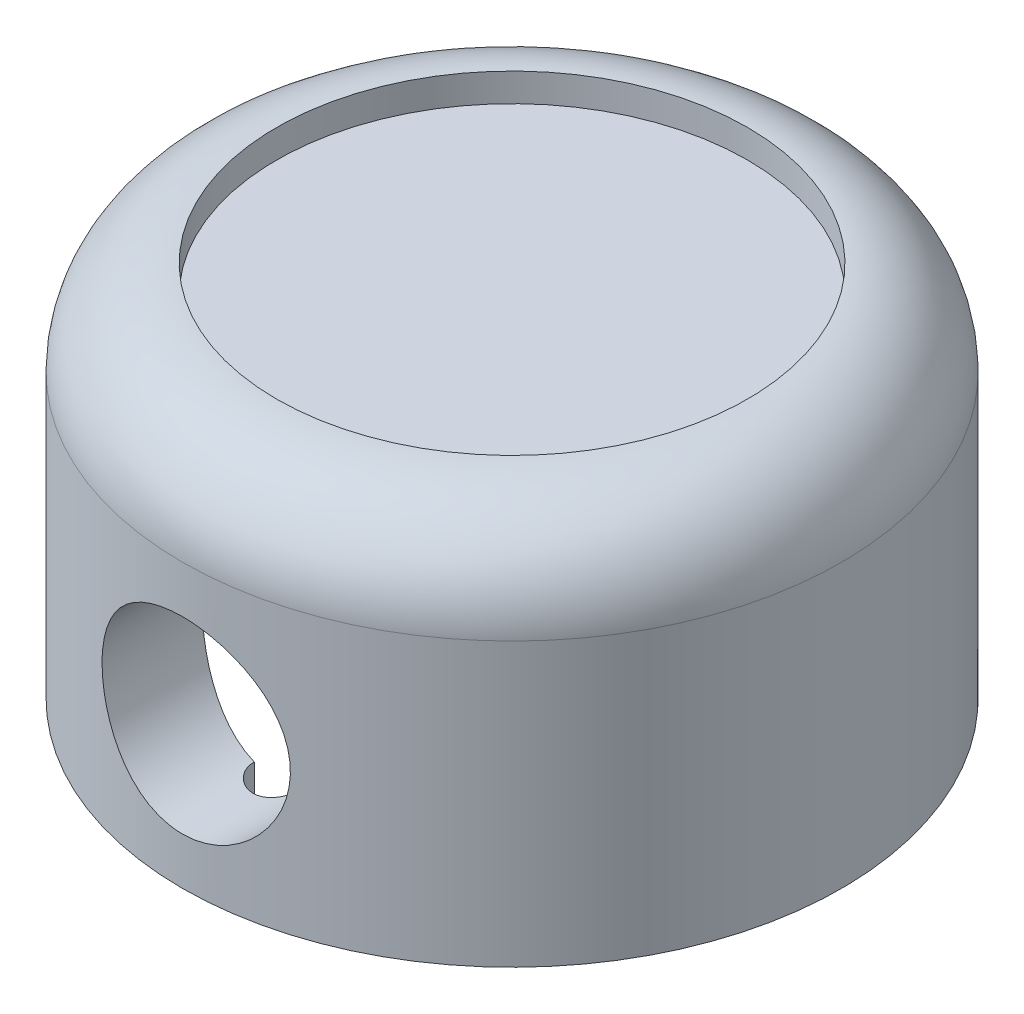
ISO-10303-21;
HEADER;
FILE_DESCRIPTION(('STEP AP214'),'2;1');
FILE_NAME('part.step','',(''),(''),'','','');
FILE_SCHEMA(('AUTOMOTIVE_DESIGN { 1 0 10303 214 1 1 1 1 }'));
ENDSEC;
DATA;
#1=APPLICATION_CONTEXT('core data for automotive mechanical design processes');
#2=APPLICATION_PROTOCOL_DEFINITION('international standard','automotive_design',2000,#1);
#3=PRODUCT_CONTEXT('',#1,'mechanical');
#4=PRODUCT('Part','Part','',(#3));
#5=PRODUCT_RELATED_PRODUCT_CATEGORY('part','',(#4));
#6=PRODUCT_DEFINITION_FORMATION('','',#4);
#7=PRODUCT_DEFINITION_CONTEXT('part definition',#1,'design');
#8=PRODUCT_DEFINITION('design','',#6,#7);
#9=PRODUCT_DEFINITION_SHAPE('','',#8);
#10=(LENGTH_UNIT() NAMED_UNIT(*) SI_UNIT(.MILLI.,.METRE.));
#11=(NAMED_UNIT(*) PLANE_ANGLE_UNIT() SI_UNIT($,.RADIAN.));
#12=(NAMED_UNIT(*) SI_UNIT($,.STERADIAN.) SOLID_ANGLE_UNIT());
#13=UNCERTAINTY_MEASURE_WITH_UNIT(LENGTH_MEASURE(1.E-05),#10,'distance_accuracy_value','');
#14=(GEOMETRIC_REPRESENTATION_CONTEXT(3) GLOBAL_UNCERTAINTY_ASSIGNED_CONTEXT((#13)) GLOBAL_UNIT_ASSIGNED_CONTEXT((#10,
#11,#12)) REPRESENTATION_CONTEXT('',''));
#15=CARTESIAN_POINT('',(0.,0.,0.));
#16=DIRECTION('',(0.,0.,1.));
#17=DIRECTION('',(1.,0.,0.));
#18=AXIS2_PLACEMENT_3D('',#15,#16,#17);
#19=CARTESIAN_POINT('',(0.,40.,0.));
#20=DIRECTION('',(0.,-1.,0.));
#21=DIRECTION('',(0.,0.,-1.));
#22=AXIS2_PLACEMENT_3D('',#19,#20,#21);
#23=CYLINDRICAL_SURFACE('',#22,35.);
#24=CARTESIAN_POINT('',(0.,30.,0.));
#25=DIRECTION('',(0.,1.,0.));
#26=DIRECTION('',(0.,0.,1.));
#27=AXIS2_PLACEMENT_3D('',#24,#25,#26);
#28=CIRCLE('',#27,35.);
#29=CARTESIAN_POINT('',(0.,30.,35.));
#30=VERTEX_POINT('',#29);
#31=EDGE_CURVE('E99',#30,#30,#28,.F.);
#32=ORIENTED_EDGE('',*,*,#31,.T.);
#33=EDGE_LOOP('',(#32));
#34=FACE_BOUND('',#33,.T.);
#35=CARTESIAN_POINT('',(0.,0.,0.));
#36=DIRECTION('',(0.,1.,0.));
#37=DIRECTION('',(0.,0.,1.));
#38=AXIS2_PLACEMENT_3D('',#35,#36,#37);
#39=CIRCLE('',#38,35.);
#40=CARTESIAN_POINT('',(0.,0.,35.));
#41=VERTEX_POINT('',#40);
#42=EDGE_CURVE('E95',#41,#41,#39,.T.);
#43=ORIENTED_EDGE('',*,*,#42,.T.);
#44=EDGE_LOOP('',(#43));
#45=FACE_BOUND('',#44,.T.);
#46=CARTESIAN_POINT('',(-10.,15.,33.5410196624969));
#47=CARTESIAN_POINT('',(-9.99999923943393,14.7253565987537,33.5410201992863));
#48=CARTESIAN_POINT('',(-9.98867606575019,14.4506994048518,33.5444021363806));
#49=CARTESIAN_POINT('',(-9.94348425866186,13.9034012047106,33.557825731312));
#50=CARTESIAN_POINT('',(-9.90961410570278,13.6307603356139,33.5678678380112));
#51=CARTESIAN_POINT('',(-9.81961797450427,13.0893918730771,33.5943045622518));
#52=CARTESIAN_POINT('',(-9.76348407483999,12.8206657078049,33.6107014407688));
#53=CARTESIAN_POINT('',(-9.6294520159476,12.2891369773045,33.6493463571709));
#54=CARTESIAN_POINT('',(-9.55155411669808,12.0263343413581,33.6715943251624));
#55=CARTESIAN_POINT('',(-9.37479910448402,11.508903174997,33.7212328436465));
#56=CARTESIAN_POINT('',(-9.27597915155491,11.2542610617943,33.7486142667736));
#57=CARTESIAN_POINT('',(-9.05803263826671,10.7542427264201,33.8077622767824));
#58=CARTESIAN_POINT('',(-8.93889858444172,10.5088699644748,33.8395304810347));
#59=CARTESIAN_POINT('',(-8.68124206203328,10.0290666453522,33.9065442661613));
#60=CARTESIAN_POINT('',(-8.54272197507522,9.79463474877116,33.9417894197265));
#61=CARTESIAN_POINT('',(-8.24723434602684,9.33810401685897,34.0147950055007));
#62=CARTESIAN_POINT('',(-8.090265863283,9.11600581125347,34.0525555659236));
#63=CARTESIAN_POINT('',(-7.75460487096429,8.67989155590115,34.1305808420949));
#64=CARTESIAN_POINT('',(-7.57545404484593,8.46623520563427,34.170885123872));
#65=CARTESIAN_POINT('',(-7.19999478580579,8.05466572013702,34.251962754991));
#66=CARTESIAN_POINT('',(-7.00368610869029,7.85675280904679,34.2927361110017));
#67=CARTESIAN_POINT('',(-6.59513723687237,7.47791379491036,34.3736457919725));
#68=CARTESIAN_POINT('',(-6.38289495997761,7.29698991895773,34.4137820328418));
#69=CARTESIAN_POINT('',(-5.94384830597081,6.95336245147747,34.4923236506202));
#70=CARTESIAN_POINT('',(-5.71704434175754,6.79065834368435,34.5307290765542));
#71=CARTESIAN_POINT('',(-5.24589871717486,6.48170264094959,34.6054691038345));
#72=CARTESIAN_POINT('',(-5.00130689562593,6.33581940111093,34.6417509595107));
#73=CARTESIAN_POINT('',(-4.50023789710562,6.06529862970371,34.7103985859168));
#74=CARTESIAN_POINT('',(-4.24376537586269,5.94065286383152,34.7427658730046));
#75=CARTESIAN_POINT('',(-3.7206154189193,5.71354002501999,34.8026771023564));
#76=CARTESIAN_POINT('',(-3.45393745468337,5.61107410259933,34.8302207943955));
#77=CARTESIAN_POINT('',(-2.91232107561406,5.42921196691536,34.8796834683892));
#78=CARTESIAN_POINT('',(-2.63738291528026,5.34981504369058,34.9016026234397));
#79=CARTESIAN_POINT('',(-2.0885672944864,5.21656845697362,34.9386826521512));
#80=CARTESIAN_POINT('',(-1.81484942639095,5.16210611851392,34.9540049794983));
#81=CARTESIAN_POINT('',(-1.2635414420587,5.07622619727473,34.9782730447546));
#82=CARTESIAN_POINT('',(-0.985951386999628,5.04480825082994,34.9872188832918));
#83=CARTESIAN_POINT('',(-0.429027749130405,5.00530869070451,34.9984784701866));
#84=CARTESIAN_POINT('',(-0.1496944626739,4.9972232132236,35.0007933166201));
#85=CARTESIAN_POINT('',(0.408641816258127,5.00445320033095,34.9987277265144));
#86=CARTESIAN_POINT('',(0.687644814112346,5.01976827844912,34.9943474005488));
#87=CARTESIAN_POINT('',(1.23515784053592,5.07287391329745,34.9792397154471));
#88=CARTESIAN_POINT('',(1.50373774700618,5.11000071999044,34.9686998445269));
#89=CARTESIAN_POINT('',(2.03670384563232,5.20586167306344,34.941709060937));
#90=CARTESIAN_POINT('',(2.30109013269278,5.26459532973534,34.9252582822352));
#91=CARTESIAN_POINT('',(2.82381948161548,5.40316989392196,34.8868846549169));
#92=CARTESIAN_POINT('',(3.08216340315882,5.48300777869057,34.8649625899747));
#93=CARTESIAN_POINT('',(3.59122516021104,5.66318928676436,34.8162105136581));
#94=CARTESIAN_POINT('',(3.84194009097107,5.76354061107571,34.7893786594842));
#95=CARTESIAN_POINT('',(4.33666969561683,5.98514846863985,34.7311963461476));
#96=CARTESIAN_POINT('',(4.58058391320967,6.10661729041598,34.6998005905425));
#97=CARTESIAN_POINT('',(5.05734276799434,6.36881797067281,34.6335273931315));
#98=CARTESIAN_POINT('',(5.29018684638013,6.50955080018721,34.5986497758407));
#99=CARTESIAN_POINT('',(5.74340125100719,6.8093241268322,34.5263090576622));
#100=CARTESIAN_POINT('',(5.96376958726054,6.96836753245177,34.4888455464054));
#101=CARTESIAN_POINT('',(6.39066970392855,7.30370095064087,34.4122997982213));
#102=CARTESIAN_POINT('',(6.59720116812989,7.47999135712884,34.3732175243335));
#103=CARTESIAN_POINT('',(7.0021880140222,7.85519686450796,34.2930526893021));
#104=CARTESIAN_POINT('',(7.20010450632117,8.0546893405514,34.2519480998279));
#105=CARTESIAN_POINT('',(7.57849520182946,8.46966630876146,34.1702192925668));
#106=CARTESIAN_POINT('',(7.75896961996977,8.68515060381009,34.1295950688659));
#107=CARTESIAN_POINT('',(8.10132677211669,9.13080251673722,34.0499546392467));
#108=CARTESIAN_POINT('',(8.26320392956362,9.36097450684121,34.0109389178896));
#109=CARTESIAN_POINT('',(8.56710954476448,9.83437147886084,33.9356617944146));
#110=CARTESIAN_POINT('',(8.70914570411852,10.0775913450109,33.8993993260865));
#111=CARTESIAN_POINT('',(8.97347330027555,10.5776245245342,33.8303946097299));
#112=CARTESIAN_POINT('',(9.09559271116304,10.8345331973057,33.7976837718125));
#113=CARTESIAN_POINT('',(9.31767539200051,11.3583189392951,33.7371336023622));
#114=CARTESIAN_POINT('',(9.41763845443788,11.6251961018487,33.709294316456));
#115=CARTESIAN_POINT('',(9.59452639566767,12.1669389094317,33.6593748681741));
#116=CARTESIAN_POINT('',(9.67145677044556,12.4418026315334,33.6372933320655));
#117=CARTESIAN_POINT('',(9.80160754454035,12.997521301808,33.5995995630494));
#118=CARTESIAN_POINT('',(9.85482879316429,13.2783760349934,33.5839870984086));
#119=CARTESIAN_POINT('',(9.93565594606216,13.8342708304313,33.5601616869136));
#120=CARTESIAN_POINT('',(9.96407237790455,14.1091832404242,33.551714878982));
#121=CARTESIAN_POINT('',(9.99805219418052,14.6605393238799,33.5416050759297));
#122=CARTESIAN_POINT('',(10.0036160954347,14.9369829625717,33.5399419273932));
#123=CARTESIAN_POINT('',(9.99184034780525,15.4893052345236,33.5434518569622));
#124=CARTESIAN_POINT('',(9.97450330046126,15.7651839283958,33.5486241585629));
#125=CARTESIAN_POINT('',(9.91709091617231,16.3143543667096,33.5656401935583));
#126=CARTESIAN_POINT('',(9.87701573818623,16.5876461292226,33.5774838803144));
#127=CARTESIAN_POINT('',(9.77567915809121,17.123367713533,33.607124367067));
#128=CARTESIAN_POINT('',(9.71492934555663,17.3859025531028,33.6247771035844));
#129=CARTESIAN_POINT('',(9.57256102543981,17.904911675211,33.6655841318637));
#130=CARTESIAN_POINT('',(9.49093503634264,18.1613837489289,33.6887403957455));
#131=CARTESIAN_POINT('',(9.30749659302216,18.6664247047087,33.739880888404));
#132=CARTESIAN_POINT('',(9.20568941567636,18.9149956330501,33.7678638548704));
#133=CARTESIAN_POINT('',(8.9825948674385,19.4028355055378,33.8278927785026));
#134=CARTESIAN_POINT('',(8.86130002196634,19.6421008365686,33.8599402936465));
#135=CARTESIAN_POINT('',(8.59693013091352,20.1154727521168,33.9280395428965));
#136=CARTESIAN_POINT('',(8.4533970367148,20.3493122584578,33.9641697194119));
#137=CARTESIAN_POINT('',(8.14774216839361,20.8042601338834,34.038787400789));
#138=CARTESIAN_POINT('',(7.98561203232732,21.0253627083026,34.0772759624195));
#139=CARTESIAN_POINT('',(7.64384747368883,21.4534191053329,34.1555606749632));
#140=CARTESIAN_POINT('',(7.46420973975091,21.6603702387133,34.1953570722918));
#141=CARTESIAN_POINT('',(7.08867051783361,22.0587287192906,34.2751743716915));
#142=CARTESIAN_POINT('',(6.8927759319008,22.250142595432,34.3151951718283));
#143=CARTESIAN_POINT('',(6.47888206853383,22.6226126923105,34.3957851138339));
#144=CARTESIAN_POINT('',(6.26035551492952,22.8030896578212,34.4363260927693));
#145=CARTESIAN_POINT('',(5.80862563123667,23.1449413837777,34.5153939300819));
#146=CARTESIAN_POINT('',(5.57542772907471,23.3063231459153,34.5539215238013));
#147=CARTESIAN_POINT('',(5.09572436736377,23.6089513994419,34.6279150591104));
#148=CARTESIAN_POINT('',(4.84921406074907,23.7501904877737,34.6633798731542));
#149=CARTESIAN_POINT('',(4.34472846041852,24.0113246765861,34.7302179651174));
#150=CARTESIAN_POINT('',(4.08675792584357,24.1312285353947,34.7615929205442));
#151=CARTESIAN_POINT('',(3.56303209887874,24.3479683403698,34.8191566919847));
#152=CARTESIAN_POINT('',(3.29734986438354,24.4449708456765,34.8453827044689));
#153=CARTESIAN_POINT('',(2.75826328768669,24.616234503212,34.8921936038076));
#154=CARTESIAN_POINT('',(2.48485895562917,24.6904956853134,34.9127784980723));
#155=CARTESIAN_POINT('',(1.93241017844305,24.8155990905264,34.9477091430746));
#156=CARTESIAN_POINT('',(1.65336695227034,24.8664463196635,34.9620562274521));
#157=CARTESIAN_POINT('',(1.09171365958663,24.9442712956776,34.9840982946887));
#158=CARTESIAN_POINT('',(0.80910369969778,24.9712497543694,34.9917934759208));
#159=CARTESIAN_POINT('',(0.252462084131185,25.000559797146,35.0001573187687));
#160=CARTESIAN_POINT('',(-0.0215225513273047,25.0037231283591,35.0010630963484));
#161=CARTESIAN_POINT('',(-0.568768883543392,24.9875638742855,34.9964479738474));
#162=CARTESIAN_POINT('',(-0.842030598167435,24.9682418500102,34.9909272341089));
#163=CARTESIAN_POINT('',(-1.38583535326669,24.9072861505987,34.9736110214422));
#164=CARTESIAN_POINT('',(-1.65637853405987,24.8656536331146,34.9618158740823));
#165=CARTESIAN_POINT('',(-2.19283017136799,24.7604410457071,34.9322725193019));
#166=CARTESIAN_POINT('',(-2.45873860818701,24.6968608825383,34.9145242865896));
#167=CARTESIAN_POINT('',(-2.98165821193156,24.5489721373291,34.8737418337707));
#168=CARTESIAN_POINT('',(-3.23872858450436,24.4648588595037,34.8507575473881));
#169=CARTESIAN_POINT('',(-3.74489266568276,24.2762466106849,34.800007231243));
#170=CARTESIAN_POINT('',(-3.99398346847017,24.1717403094946,34.7722394825046));
#171=CARTESIAN_POINT('',(-4.48248170432188,23.9431579285943,34.7126476385437));
#172=CARTESIAN_POINT('',(-4.72188994298113,23.8190834811913,34.6808238817019));
#173=CARTESIAN_POINT('',(-5.18958184588027,23.5522356103247,34.6139286395569));
#174=CARTESIAN_POINT('',(-5.41786490285218,23.4094611676871,34.5788569772693));
#175=CARTESIAN_POINT('',(-5.86853397113377,23.1016643005632,34.5052746695351));
#176=CARTESIAN_POINT('',(-6.09054294599143,22.9361066775567,34.4666927858993));
#177=CARTESIAN_POINT('',(-6.51992039889811,22.5873019116465,34.3880544304596));
#178=CARTESIAN_POINT('',(-6.72728862045331,22.4040544589648,34.3479979328403));
#179=CARTESIAN_POINT('',(-7.12614815443181,22.0210032369391,34.2674689061437));
#180=CARTESIAN_POINT('',(-7.31763512224942,21.8211949667763,34.2269962666045));
#181=CARTESIAN_POINT('',(-7.68345411659888,21.4063264052752,34.146736421132));
#182=CARTESIAN_POINT('',(-7.85778643153596,21.1912663704552,34.1069492036846));
#183=CARTESIAN_POINT('',(-8.19254839714506,20.7413278801249,34.0281135221844));
#184=CARTESIAN_POINT('',(-8.35248651731939,20.5060750133751,33.9891126599732));
#185=CARTESIAN_POINT('',(-8.65187712802938,20.0225344403465,33.9141392284172));
#186=CARTESIAN_POINT('',(-8.79133706818808,19.7742515190254,33.8781655598728));
#187=CARTESIAN_POINT('',(-9.04873375864626,19.2663166544722,33.8103258761863));
#188=CARTESIAN_POINT('',(-9.16667661481195,19.0066679624985,33.7784586965091));
#189=CARTESIAN_POINT('',(-9.38011072605113,18.4777611631818,33.7198129801321));
#190=CARTESIAN_POINT('',(-9.47560457557733,18.2085041704258,33.6930338554698));
#191=CARTESIAN_POINT('',(-9.63217171968068,17.6986372891073,33.648580492045));
#192=CARTESIAN_POINT('',(-9.69613238055121,17.4589736791344,33.6301693020325));
#193=CARTESIAN_POINT('',(-9.80613540501045,16.9751610978291,33.5982588457961));
#194=CARTESIAN_POINT('',(-9.85217247767412,16.7310108243022,33.584761030044));
#195=CARTESIAN_POINT('',(-9.92595998535746,16.2397594926423,33.5630272904321));
#196=CARTESIAN_POINT('',(-9.95371266668255,15.9926588007782,33.5547907202125));
#197=CARTESIAN_POINT('',(-9.99072994313014,15.4970421717581,33.543787573157));
#198=CARTESIAN_POINT('',(-10.0000006882416,15.248526732983,33.5410191767524));
#199=CARTESIAN_POINT('',(-10.,15.,33.5410196624969));
#200=B_SPLINE_CURVE_WITH_KNOTS('',3,(#46,#47,#48,#49,#50,#51,#52,#53,#54,#55,#56,#57,#58,#59,
#60,#61,#62,#63,#64,#65,#66,#67,#68,#69,#70,#71,#72,#73,#74,#75,#76,#77,#78,#79,#80,#81,#82,#83,
#84,#85,#86,#87,#88,#89,#90,#91,#92,#93,#94,#95,#96,#97,#98,#99,#100,#101,#102,#103,#104,#105,
#106,#107,#108,#109,#110,#111,#112,#113,#114,#115,#116,#117,#118,#119,#120,#121,#122,#123,#124,
#125,#126,#127,#128,#129,#130,#131,#132,#133,#134,#135,#136,#137,#138,#139,#140,#141,#142,#143,
#144,#145,#146,#147,#148,#149,#150,#151,#152,#153,#154,#155,#156,#157,#158,#159,#160,#161,#162,
#163,#164,#165,#166,#167,#168,#169,#170,#171,#172,#173,#174,#175,#176,#177,#178,#179,#180,#181,
#182,#183,#184,#185,#186,#187,#188,#189,#190,#191,#192,#193,#194,#195,#196,#197,#198,#199),
.UNSPECIFIED.,.T.,.F.,(4,2,2,2,2,2,2,2,2,2,2,2,2,2,2,2,2,2,2,2,2,2,2,2,2,2,2,2,2,2,2,2,2,2,2,2,
2,2,2,2,2,2,2,2,2,2,2,2,2,2,2,2,2,2,2,2,2,2,2,2,2,2,2,2,2,2,2,2,2,2,2,2,2,2,2,2,4),(0.,
0.823701047760434,1.64745761450443,2.47150753654053,3.29554761543278,4.1181361992458,
4.94102887859512,5.7638205520025,6.58665419642647,7.43085740850721,8.27507263740161,
9.11939838047032,9.96370019312419,10.8239325239474,11.6838305582612,12.5437731867495,
13.4036893472143,14.2411626012325,15.0786226387379,15.915943986932,16.7532515065588,
17.5663100376489,18.3793501423217,19.1922738587792,20.0055033194671,20.8274383245668,
21.6494147759067,22.4715219722572,23.2936479497759,24.1446658633096,24.9956732887877,
25.846935234275,26.6978658251586,27.555795965154,28.413734140038,29.2714674330294,
30.1291699978733,30.9576666225657,31.7861445103174,32.6145282913652,33.4429062813767,
34.2521198575801,35.0616238436492,35.8709164431464,36.680520194662,37.5098183779317,
38.3394909180948,39.1693206871764,39.998799926782,40.8566875964613,41.7142597207966,
42.5721462216683,43.4296797348486,44.2807698766978,45.1318589005646,45.9827658725606,
46.8336474679393,47.6546676233018,48.475667294582,49.2966243697632,50.1175849328532,
50.9310218536438,51.7447517017076,52.5584137071113,53.3721200766204,54.2100155993226,
55.0479257976172,55.8860644705246,56.7241890501773,57.5845487346957,58.4445946550489,
59.3043961407341,60.1640982094517,60.9095909280825,61.6553035446948,62.4009245306496,
63.1462973647523),.UNSPECIFIED.);
#201=CARTESIAN_POINT('',(-10.,15.,33.5410196624969));
#202=VERTEX_POINT('',#201);
#203=EDGE_CURVE('E134',#202,#202,#200,.T.);
#204=ORIENTED_EDGE('',*,*,#203,.F.);
#205=EDGE_LOOP('',(#204));
#206=FACE_BOUND('',#205,.T.);
#207=ADVANCED_FACE('F33',(#34,#45,#206),#23,.T.);
#208=CARTESIAN_POINT('',(0.,30.,0.));
#209=DIRECTION('',(0.,-1.,0.));
#210=DIRECTION('',(0.,0.,-1.));
#211=AXIS2_PLACEMENT_3D('',#208,#209,#210);
#212=CYLINDRICAL_SURFACE('',#211,25.);
#213=CARTESIAN_POINT('',(0.,30.,0.));
#214=DIRECTION('',(0.,-1.,0.));
#215=DIRECTION('',(0.,0.,-1.));
#216=AXIS2_PLACEMENT_3D('',#213,#214,#215);
#217=CIRCLE('',#216,25.);
#218=CARTESIAN_POINT('',(-2.49687304442977,30.,24.875));
#219=VERTEX_POINT('',#218);
#220=CARTESIAN_POINT('',(2.49687304442977,30.,24.875));
#221=VERTEX_POINT('',#220);
#222=EDGE_CURVE('E89',#219,#221,#217,.T.);
#223=ORIENTED_EDGE('',*,*,#222,.F.);
#224=DIRECTION('',(0.,-1.,0.));
#225=VECTOR('',#224,1.);
#226=CARTESIAN_POINT('',(-2.49687304442977,15.,24.875));
#227=LINE('',#226,#225);
#228=CARTESIAN_POINT('',(-2.49687304442977,24.6832652034322,24.875));
#229=VERTEX_POINT('',#228);
#230=EDGE_CURVE('E79',#219,#229,#227,.T.);
#231=ORIENTED_EDGE('',*,*,#230,.T.);
#232=CARTESIAN_POINT('',(-10.,15.,22.9128784747792));
#233=CARTESIAN_POINT('',(-9.99999793321158,15.2679432996908,22.9128805408451));
#234=CARTESIAN_POINT('',(-9.98921628888234,15.5359684587335,22.9175942500596));
#235=CARTESIAN_POINT('',(-9.94619451282887,16.0700814269152,22.9362975822814));
#236=CARTESIAN_POINT('',(-9.91394124728221,16.3361679494525,22.9502928826588));
#237=CARTESIAN_POINT('',(-9.82822912582097,16.8648801993843,22.9871287793724));
#238=CARTESIAN_POINT('',(-9.77472444822009,17.1274971732042,23.0099884863473));
#239=CARTESIAN_POINT('',(-9.64706427262734,17.6468219285182,23.0638014913945));
#240=CARTESIAN_POINT('',(-9.57290716161962,17.9035292467545,23.0947554216379));
#241=CARTESIAN_POINT('',(-9.40498076098218,18.408346152386,23.1636467363272));
#242=CARTESIAN_POINT('',(-9.31128864382297,18.656485221583,23.2015565729952));
#243=CARTESIAN_POINT('',(-9.10492212636566,19.14371867761,23.2833138782598));
#244=CARTESIAN_POINT('',(-8.99224708531699,19.3828127588015,23.3271615472725));
#245=CARTESIAN_POINT('',(-8.74882020570514,19.8505252838395,23.4195445548277));
#246=CARTESIAN_POINT('',(-8.61807705058089,20.0791486899825,23.468077638228));
#247=CARTESIAN_POINT('',(-8.33935515193117,20.5248832390705,23.5685622621145));
#248=CARTESIAN_POINT('',(-8.1913701023574,20.7419901274503,23.6205150502817));
#249=CARTESIAN_POINT('',(-7.70678893382989,21.3960438329182,23.7849852068794));
#250=CARTESIAN_POINT('',(-7.34201789012633,21.8116724290215,23.9011684270195));
#251=CARTESIAN_POINT('',(-6.54842438515518,22.5777547104476,24.1306503294368));
#252=CARTESIAN_POINT('',(-6.11957963482135,22.9281856200862,24.2439479918097));
#253=CARTESIAN_POINT('',(-5.426873852879,23.4042811579112,24.4050933288709));
#254=CARTESIAN_POINT('',(-5.18254798242876,23.5571298218655,24.458266992319));
#255=CARTESIAN_POINT('',(-4.68080345216479,23.8415568687113,24.5592227290752));
#256=CARTESIAN_POINT('',(-4.42339024320005,23.9731440131041,24.6070070207856));
#257=CARTESIAN_POINT('',(-3.89719145764577,24.2138821366084,24.6958115621907));
#258=CARTESIAN_POINT('',(-3.62840695194562,24.3230352227962,24.7368324470539));
#259=CARTESIAN_POINT('',(-3.08138490461891,24.5178430275601,24.8109091084033));
#260=CARTESIAN_POINT('',(-2.80314796823089,24.6034992474641,24.8439653937695));
#261=CARTESIAN_POINT('',(-2.25304981478946,24.746825348102,24.8997281846262));
#262=CARTESIAN_POINT('',(-1.98153191139516,24.8056492198736,24.9228582219961));
#263=CARTESIAN_POINT('',(-1.43394947548978,24.9005550543263,24.9603502443495));
#264=CARTESIAN_POINT('',(-1.15788507737141,24.9366376879963,24.9747124880296));
#265=CARTESIAN_POINT('',(-0.603472781279831,24.9856518014823,24.9942540664145));
#266=CARTESIAN_POINT('',(-0.325125637591996,24.9985906417451,24.9994363206366));
#267=CARTESIAN_POINT('',(0.231690269616357,25.0011911028775,25.0004763776147));
#268=CARTESIAN_POINT('',(0.510159028517066,24.9908535420849,24.9963345081827));
#269=CARTESIAN_POINT('',(1.04935083242227,24.9482580862048,24.9793412742765));
#270=CARTESIAN_POINT('',(1.31019093753995,24.9172659929366,24.9669929535766));
#271=CARTESIAN_POINT('',(1.82813508164227,24.8349721029775,24.9344189482698));
#272=CARTESIAN_POINT('',(2.08523928684811,24.783671212771,24.9141936152544));
#273=CARTESIAN_POINT('',(2.59398534293472,24.6612473231527,24.8663734455137));
#274=CARTESIAN_POINT('',(2.84562699700255,24.590123610808,24.8387783437343));
#275=CARTESIAN_POINT('',(3.34183184481278,24.4286921536171,24.77689814144));
#276=CARTESIAN_POINT('',(3.58639483830152,24.3383838666453,24.7426128518732));
#277=CARTESIAN_POINT('',(4.07053573294833,24.1378557180443,24.667623206917));
#278=CARTESIAN_POINT('',(4.30998577822872,24.0273602314062,24.6268311351153));
#279=CARTESIAN_POINT('',(4.77877806490355,23.7882052049364,24.5401737748753));
#280=CARTESIAN_POINT('',(5.00811663404913,23.6595391361319,24.494306664185));
#281=CARTESIAN_POINT('',(5.45537645337102,23.3849706078534,24.3985896749035));
#282=CARTESIAN_POINT('',(5.67329680060029,23.2390667881877,24.3487394821171));
#283=CARTESIAN_POINT('',(6.09659718709495,22.9309547182824,24.2462149424079));
#284=CARTESIAN_POINT('',(6.30197630161439,22.7687452680515,24.1935403877634));
#285=CARTESIAN_POINT('',(6.71221301735345,22.4178004380539,24.0830694630538));
#286=CARTESIAN_POINT('',(6.9161504181863,22.2280225901472,24.0251639209819));
#287=CARTESIAN_POINT('',(7.30745656576433,21.8321695979633,23.9090514618511));
#288=CARTESIAN_POINT('',(7.49482468243988,21.6260938344996,23.8508445334205));
#289=CARTESIAN_POINT('',(7.85194731916161,21.1987488211308,23.7356723512));
#290=CARTESIAN_POINT('',(8.02169566403247,20.9774742893816,23.6787075382205));
#291=CARTESIAN_POINT('',(8.34241283442462,20.5210453131974,23.5676251560312));
#292=CARTESIAN_POINT('',(8.49338248390242,20.2858914784153,23.513507461958));
#293=CARTESIAN_POINT('',(8.77952196622691,19.7961140455099,23.4082017032714));
#294=CARTESIAN_POINT('',(8.91411616997539,19.541125892799,23.3571417580589));
#295=CARTESIAN_POINT('',(9.16111521734942,19.0195989781079,23.2613739872971));
#296=CARTESIAN_POINT('',(9.27352962681967,18.7530652563292,23.2166634256868));
#297=CARTESIAN_POINT('',(9.47512554120231,18.2102622099062,23.135121107202));
#298=CARTESIAN_POINT('',(9.56431408789334,17.9339958649728,23.0982869629079));
#299=CARTESIAN_POINT('',(9.71852350581113,17.373750769702,23.0338295541397));
#300=CARTESIAN_POINT('',(9.78354632256829,17.0897726421995,23.0062055481958));
#301=CARTESIAN_POINT('',(9.88543600469156,16.5339616488054,22.9626006906713));
#302=CARTESIAN_POINT('',(9.9237804029209,16.2624467994494,22.9460115898205));
#303=CARTESIAN_POINT('',(9.97804609794811,15.7167707050781,22.9224667142984));
#304=CARTESIAN_POINT('',(9.99396831459955,15.4426095690894,22.9155105444435));
#305=CARTESIAN_POINT('',(10.003200377686,14.8939083288674,22.9114819849895));
#306=CARTESIAN_POINT('',(9.99651620753229,14.6193683441339,22.9144069800642));
#307=CARTESIAN_POINT('',(9.96062826175442,14.0720505035257,22.9300298105342));
#308=CARTESIAN_POINT('',(9.93142505386306,13.7992726034013,22.9427273995504));
#309=CARTESIAN_POINT('',(9.85315233472955,13.2731445087475,22.9764462222691));
#310=CARTESIAN_POINT('',(9.80531592526264,13.0195761453246,22.9969492930814));
#311=CARTESIAN_POINT('',(9.69038472806974,12.517503729542,23.0456142329536));
#312=CARTESIAN_POINT('',(9.62328326168505,12.2690014655102,23.0737787578481));
#313=CARTESIAN_POINT('',(9.47045293684303,11.7787520693634,23.1369260407722));
#314=CARTESIAN_POINT('',(9.3847279960203,11.5370035285874,23.1719073646605));
#315=CARTESIAN_POINT('',(9.19531146757514,11.0615011126575,23.2477235422388));
#316=CARTESIAN_POINT('',(9.09161286965463,10.8277503996655,23.2885606788048));
#317=CARTESIAN_POINT('',(8.86252494540217,10.3603803267584,23.3767257569357));
#318=CARTESIAN_POINT('',(8.73643228058633,10.1271425152155,23.4242483826544));
#319=CARTESIAN_POINT('',(8.46649303986494,9.67190848783956,23.5231622000212));
#320=CARTESIAN_POINT('',(8.3226386162533,9.44991730265288,23.5745550977376));
#321=CARTESIAN_POINT('',(8.01810592519979,9.01838430413272,23.6798634028616));
#322=CARTESIAN_POINT('',(7.85742543864996,8.8088441386304,23.7337791424744));
#323=CARTESIAN_POINT('',(7.52017263354357,8.40329139811516,23.8427852304702));
#324=CARTESIAN_POINT('',(7.34359969237808,8.20727935361707,23.8978756248072));
#325=CARTESIAN_POINT('',(6.96183884376272,7.81578215986585,24.0119837921073));
#326=CARTESIAN_POINT('',(6.75549995846805,7.62141398560089,24.0709898540173));
#327=CARTESIAN_POINT('',(6.32685407241112,7.25073048168258,24.1871909345491));
#328=CARTESIAN_POINT('',(6.10455258076575,7.07440897411934,24.2443865682715));
#329=CARTESIAN_POINT('',(5.64510225746265,6.74085713255765,24.3554653984334));
#330=CARTESIAN_POINT('',(5.40794641837471,6.5836359133606,24.4093470073871));
#331=CARTESIAN_POINT('',(4.92042054662138,6.28963538979062,24.512272302061));
#332=CARTESIAN_POINT('',(4.6700562774784,6.15284726761244,24.5613180715403));
#333=CARTESIAN_POINT('',(4.15761008764836,5.90077965742746,24.6532357367097));
#334=CARTESIAN_POINT('',(3.89552765661766,5.78550110732828,24.6961073631627));
#335=CARTESIAN_POINT('',(3.36145875104921,5.57754237399998,24.7744510355347));
#336=CARTESIAN_POINT('',(3.08947219105583,5.48486238581078,24.8099230175899));
#337=CARTESIAN_POINT('',(2.53774672432055,5.32309740699094,24.8724119460142));
#338=CARTESIAN_POINT('',(2.25801133975319,5.25400188047433,24.8994326673624));
#339=CARTESIAN_POINT('',(1.69291011722583,5.14012604907575,24.9442251001433));
#340=CARTESIAN_POINT('',(1.40754466127257,5.0953441003299,24.9619974368647));
#341=CARTESIAN_POINT('',(0.852327041038537,5.03273264714469,24.9869097440467));
#342=CARTESIAN_POINT('',(0.582678436747231,5.01333434107594,24.9946681311648));
#343=CARTESIAN_POINT('',(0.042592088737982,4.99644212913902,25.0014220836823));
#344=CARTESIAN_POINT('',(-0.227845618024186,4.99894721342801,25.0004180530678));
#345=CARTESIAN_POINT('',(-0.767415262593964,5.02583174198126,24.9896755233896));
#346=CARTESIAN_POINT('',(-1.03654737675394,5.05020814431711,24.9799382389731));
#347=CARTESIAN_POINT('',(-1.5715226940813,5.12057173724074,24.9519951354287));
#348=CARTESIAN_POINT('',(-1.8373659095141,5.16655884720997,24.9337893478924));
#349=CARTESIAN_POINT('',(-2.35566546166351,5.27791618007253,24.8900859918907));
#350=CARTESIAN_POINT('',(-2.60828137105916,5.34264172684338,24.8648318151846));
#351=CARTESIAN_POINT('',(-3.1070604932699,5.49137623770642,24.8074428195129));
#352=CARTESIAN_POINT('',(-3.35322140843299,5.5753919670421,24.7753055868629));
#353=CARTESIAN_POINT('',(-3.83747450752422,5.76197445008805,24.7049318041109));
#354=CARTESIAN_POINT('',(-4.07556737442908,5.86453962886812,24.6666957718564));
#355=CARTESIAN_POINT('',(-4.54236828740533,6.0874359659549,24.5850167357493));
#356=CARTESIAN_POINT('',(-4.77107559601667,6.20776851691096,24.54157332378));
#357=CARTESIAN_POINT('',(-5.2277440493855,6.47103824334179,24.4484634900426));
#358=CARTESIAN_POINT('',(-5.45522634114634,6.61473892009401,24.3986069909102));
#359=CARTESIAN_POINT('',(-5.89737222856146,6.91958448538237,24.2955251578013));
#360=CARTESIAN_POINT('',(-6.11203551577375,7.08072979339692,24.2422997428276));
#361=CARTESIAN_POINT('',(-6.52749120760673,7.41951652403206,24.133751813928));
#362=CARTESIAN_POINT('',(-6.72827844688151,7.59716403251053,24.0784285308146));
#363=CARTESIAN_POINT('',(-7.11484620321665,7.96788186565889,23.967048883029));
#364=CARTESIAN_POINT('',(-7.30062657342055,8.16095234122037,23.910992511189));
#365=CARTESIAN_POINT('',(-7.6672528818151,8.57394828857107,23.7960585314582));
#366=CARTESIAN_POINT('',(-7.84707327911462,8.79479716865461,23.7372222957869));
#367=CARTESIAN_POINT('',(-8.18744004230821,9.251358991229,23.6219835943436));
#368=CARTESIAN_POINT('',(-8.34799279739824,9.48706696664177,23.5655803257902));
#369=CARTESIAN_POINT('',(-8.64881574472816,9.97213138472084,23.4568451705134));
#370=CARTESIAN_POINT('',(-8.78907751955799,10.2214934327816,23.4045149775795));
#371=CARTESIAN_POINT('',(-9.04809415075987,10.7322196599128,23.3056049837655));
#372=CARTESIAN_POINT('',(-9.16685199474662,10.9935821653838,23.2590243843614));
#373=CARTESIAN_POINT('',(-9.37213926463602,11.5026543440802,23.1770166909126));
#374=CARTESIAN_POINT('',(-9.46060466880606,11.7494838250009,23.1409637590321));
#375=CARTESIAN_POINT('',(-9.61807222426118,12.2501755167661,23.0759605006744));
#376=CARTESIAN_POINT('',(-9.68707669763829,12.5040368845878,23.0470093268642));
#377=CARTESIAN_POINT('',(-9.8048386178545,13.0165393042685,22.9971568327792));
#378=CARTESIAN_POINT('',(-9.85364421714409,13.2751674355779,22.9762363766741));
#379=CARTESIAN_POINT('',(-9.93072834935196,13.7959074693766,22.9430254003904));
#380=CARTESIAN_POINT('',(-9.95901879690778,14.0580172595887,22.9307298712265));
#381=CARTESIAN_POINT('',(-9.98460530057045,14.4338753883811,22.9195922127027));
#382=CARTESIAN_POINT('',(-9.9903763331015,14.546999256546,22.9170765795758));
#383=CARTESIAN_POINT('',(-9.99807426072076,14.7734105298192,22.9137192124228));
#384=CARTESIAN_POINT('',(-10.0000008739587,14.8866979463087,22.912877601126));
#385=CARTESIAN_POINT('',(-10.,15.,22.9128784747792));
#386=B_SPLINE_CURVE_WITH_KNOTS('',3,(#232,#233,#234,#235,#236,#237,#238,#239,#240,#241,#242,
#243,#244,#245,#246,#247,#248,#249,#250,#251,#252,#253,#254,#255,#256,#257,#258,#259,#260,#261,
#262,#263,#264,#265,#266,#267,#268,#269,#270,#271,#272,#273,#274,#275,#276,#277,#278,#279,#280,
#281,#282,#283,#284,#285,#286,#287,#288,#289,#290,#291,#292,#293,#294,#295,#296,#297,#298,#299,
#300,#301,#302,#303,#304,#305,#306,#307,#308,#309,#310,#311,#312,#313,#314,#315,#316,#317,#318,
#319,#320,#321,#322,#323,#324,#325,#326,#327,#328,#329,#330,#331,#332,#333,#334,#335,#336,#337,
#338,#339,#340,#341,#342,#343,#344,#345,#346,#347,#348,#349,#350,#351,#352,#353,#354,#355,#356,
#357,#358,#359,#360,#361,#362,#363,#364,#365,#366,#367,#368,#369,#370,#371,#372,#373,#374,#375,
#376,#377,#378,#379,#380,#381,#382,#383,#384,#385),.UNSPECIFIED.,.T.,.F.,(4,2,2,2,2,2,2,2,2,2,2,
2,2,2,2,2,2,2,2,2,2,2,2,2,2,2,2,2,2,2,2,2,2,2,2,2,2,2,2,2,2,2,2,2,2,2,2,2,2,2,2,2,2,2,2,2,2,2,2,
2,2,2,2,2,2,2,2,2,2,2,2,2,2,2,2,2,4),(0.,0.803715208350473,1.60792248777794,2.41387327194109,
3.21988702089503,4.02277500055333,4.82569008636513,5.62822062880672,6.43104561553657,
8.11835508856473,9.80625289176061,10.6844970132099,11.5623782974564,12.4401770906604,
13.3179197840048,14.1531749596772,14.9884054896715,15.8233703430992,16.658305841794,
17.446273530255,18.2342060516955,19.0221669149842,19.8101500477578,20.6098280134928,
21.4097940505085,22.2098232532391,23.0099113762244,23.8625484187629,24.7152178700584,
25.5681851532743,26.4211149974654,27.2984479616473,28.1754017129099,29.0520892728635,
29.9287062373094,30.7517641579796,31.5747883123177,32.3975946473909,33.2203802391775,
33.9960599176747,34.7720088280867,35.5477946676464,36.32388377207,37.1311108029376,
37.9386957771303,38.7463873942559,39.5541106676034,40.42173174889,41.2890548172621,
42.1567901663417,43.0241499597959,43.8915475649442,44.7589526560189,45.6259697425289,
46.4929282018953,47.3032840805173,48.1136025983591,48.9238084321417,49.734011243482,
50.5191121249472,51.3044887701903,52.0897987647656,52.8751703465358,53.6952201499923,
54.5152896769751,55.3356628478229,56.1560440458278,57.0274489962349,57.8985641835335,
58.7700397100328,59.6413940663998,60.4345380121312,61.2275872792868,62.0187349383591,
62.8094227517724,63.1492555012902,63.4891131644381),.UNSPECIFIED.);
#387=CARTESIAN_POINT('',(-2.49687304442977,5.31673479656785,24.875));
#388=VERTEX_POINT('',#387);
#389=EDGE_CURVE('E110',#388,#229,#386,.T.);
#390=ORIENTED_EDGE('',*,*,#389,.F.);
#391=CARTESIAN_POINT('',(-2.49687304442977,0.,24.875));
#392=VERTEX_POINT('',#391);
#393=EDGE_CURVE('E53',#388,#392,#227,.T.);
#394=ORIENTED_EDGE('',*,*,#393,.T.);
#395=CARTESIAN_POINT('',(0.,0.,0.));
#396=DIRECTION('',(0.,-1.,0.));
#397=DIRECTION('',(0.,0.,-1.));
#398=AXIS2_PLACEMENT_3D('',#395,#396,#397);
#399=CIRCLE('',#398,25.);
#400=CARTESIAN_POINT('',(2.49687304442977,0.,24.875));
#401=VERTEX_POINT('',#400);
#402=EDGE_CURVE('E96',#392,#401,#399,.T.);
#403=ORIENTED_EDGE('',*,*,#402,.T.);
#404=DIRECTION('',(0.,-1.,0.));
#405=VECTOR('',#404,1.);
#406=CARTESIAN_POINT('',(2.49687304442977,15.,24.875));
#407=LINE('',#406,#405);
#408=CARTESIAN_POINT('',(2.49687304442977,5.31673479656785,24.875));
#409=VERTEX_POINT('',#408);
#410=EDGE_CURVE('E83',#401,#409,#407,.F.);
#411=ORIENTED_EDGE('',*,*,#410,.T.);
#412=CARTESIAN_POINT('',(2.49687304442977,24.6832652034322,24.875));
#413=VERTEX_POINT('',#412);
#414=EDGE_CURVE('E92',#413,#409,#386,.T.);
#415=ORIENTED_EDGE('',*,*,#414,.F.);
#416=EDGE_CURVE('E60',#413,#221,#407,.F.);
#417=ORIENTED_EDGE('',*,*,#416,.T.);
#418=EDGE_LOOP('',(#223,#231,#390,#394,#403,#411,#415,#417));
#419=FACE_BOUND('',#418,.T.);
#420=ADVANCED_FACE('F88',(#419),#212,.F.);
#421=CARTESIAN_POINT('',(0.,0.,0.));
#422=DIRECTION('',(0.,1.,0.));
#423=DIRECTION('',(0.,0.,1.));
#424=AXIS2_PLACEMENT_3D('',#421,#422,#423);
#425=PLANE('',#424);
#426=ORIENTED_EDGE('',*,*,#402,.F.);
#427=CARTESIAN_POINT('',(0.,0.,25.));
#428=DIRECTION('',(0.,-1.,0.));
#429=DIRECTION('',(0.,0.,-1.));
#430=AXIS2_PLACEMENT_3D('',#427,#428,#429);
#431=CIRCLE('',#430,2.5);
#432=EDGE_CURVE('E84',#401,#392,#431,.T.);
#433=ORIENTED_EDGE('',*,*,#432,.F.);
#434=EDGE_LOOP('',(#426,#433));
#435=FACE_BOUND('',#434,.T.);
#436=ORIENTED_EDGE('',*,*,#42,.F.);
#437=EDGE_LOOP('',(#436));
#438=FACE_BOUND('',#437,.T.);
#439=ADVANCED_FACE('F142',(#435,#438),#425,.F.);
#440=CARTESIAN_POINT('',(0.,30.,0.));
#441=DIRECTION('',(0.,1.,0.));
#442=DIRECTION('',(0.,0.,1.));
#443=AXIS2_PLACEMENT_3D('',#440,#441,#442);
#444=TOROIDAL_SURFACE('',#443,25.,10.);
#445=ORIENTED_EDGE('',*,*,#31,.F.);
#446=EDGE_LOOP('',(#445));
#447=FACE_BOUND('',#446,.T.);
#448=CARTESIAN_POINT('',(0.,40.,0.));
#449=DIRECTION('',(0.,1.,0.));
#450=DIRECTION('',(0.,0.,1.));
#451=AXIS2_PLACEMENT_3D('',#448,#449,#450);
#452=CIRCLE('',#451,25.);
#453=CARTESIAN_POINT('',(0.,40.,25.));
#454=VERTEX_POINT('',#453);
#455=EDGE_CURVE('E105',#454,#454,#452,.T.);
#456=ORIENTED_EDGE('',*,*,#455,.F.);
#457=EDGE_LOOP('',(#456));
#458=FACE_BOUND('',#457,.T.);
#459=ADVANCED_FACE('F35',(#447,#458),#444,.T.);
#460=CARTESIAN_POINT('',(0.,30.,0.));
#461=DIRECTION('',(0.,-1.,0.));
#462=DIRECTION('',(0.,0.,-1.));
#463=AXIS2_PLACEMENT_3D('',#460,#461,#462);
#464=PLANE('',#463);
#465=ORIENTED_EDGE('',*,*,#222,.T.);
#466=CARTESIAN_POINT('',(0.,30.,25.));
#467=DIRECTION('',(0.,-1.,0.));
#468=DIRECTION('',(0.,0.,-1.));
#469=AXIS2_PLACEMENT_3D('',#466,#467,#468);
#470=CIRCLE('',#469,2.5);
#471=EDGE_CURVE('E76',#221,#219,#470,.T.);
#472=ORIENTED_EDGE('',*,*,#471,.T.);
#473=EDGE_LOOP('',(#465,#472));
#474=FACE_BOUND('',#473,.T.);
#475=ADVANCED_FACE('F94',(#474),#464,.T.);
#476=CARTESIAN_POINT('',(0.,37.,0.));
#477=DIRECTION('',(0.,1.,0.));
#478=DIRECTION('',(0.,0.,1.));
#479=AXIS2_PLACEMENT_3D('',#476,#477,#478);
#480=CYLINDRICAL_SURFACE('',#479,25.);
#481=CARTESIAN_POINT('',(0.,37.,0.));
#482=DIRECTION('',(0.,1.,0.));
#483=DIRECTION('',(0.,0.,1.));
#484=AXIS2_PLACEMENT_3D('',#481,#482,#483);
#485=CIRCLE('',#484,25.);
#486=CARTESIAN_POINT('',(0.,37.,25.));
#487=VERTEX_POINT('',#486);
#488=EDGE_CURVE('E102',#487,#487,#485,.T.);
#489=ORIENTED_EDGE('',*,*,#488,.F.);
#490=EDGE_LOOP('',(#489));
#491=FACE_BOUND('',#490,.T.);
#492=ORIENTED_EDGE('',*,*,#455,.T.);
#493=EDGE_LOOP('',(#492));
#494=FACE_BOUND('',#493,.T.);
#495=ADVANCED_FACE('F186',(#491,#494),#480,.F.);
#496=CARTESIAN_POINT('',(0.,37.,0.));
#497=DIRECTION('',(0.,1.,0.));
#498=DIRECTION('',(0.,0.,1.));
#499=AXIS2_PLACEMENT_3D('',#496,#497,#498);
#500=PLANE('',#499);
#501=ORIENTED_EDGE('',*,*,#488,.T.);
#502=EDGE_LOOP('',(#501));
#503=FACE_BOUND('',#502,.T.);
#504=ADVANCED_FACE('F126',(#503),#500,.T.);
#505=CARTESIAN_POINT('',(0.,15.,45.));
#506=DIRECTION('',(0.,0.,-1.));
#507=DIRECTION('',(-1.,0.,0.));
#508=AXIS2_PLACEMENT_3D('',#505,#506,#507);
#509=CYLINDRICAL_SURFACE('',#508,10.);
#510=CARTESIAN_POINT('',(1.2206531272585,24.92522069996,22.8182562151082));
#511=CARTESIAN_POINT('',(1.28246581331909,24.9176207225966,22.8528409735985));
#512=CARTESIAN_POINT('',(1.34273908615115,24.9096194341707,22.8900125784471));
#513=CARTESIAN_POINT('',(1.45986102140671,24.8930428272659,22.969283056834));
#514=CARTESIAN_POINT('',(1.51671003756198,24.884467568273,23.0113814201026));
#515=CARTESIAN_POINT('',(1.6815077684375,24.858239138196,23.144617203719));
#516=CARTESIAN_POINT('',(1.78383574887958,24.840066737333,23.242767492218));
#517=CARTESIAN_POINT('',(1.97050396145948,24.8043964359529,23.4549706530091));
#518=CARTESIAN_POINT('',(2.05483869587269,24.7868987429228,23.5690283681635));
#519=CARTESIAN_POINT('',(2.20316397220228,24.7545805580457,23.8100150714236));
#520=CARTESIAN_POINT('',(2.26716110686028,24.7397591992984,23.9369398708345));
#521=CARTESIAN_POINT('',(2.37255011069595,24.714625387634,24.1994398741912));
#522=CARTESIAN_POINT('',(2.4140680815692,24.7042878482352,24.3349619557175));
#523=CARTESIAN_POINT('',(2.47365250364906,24.6892726171548,24.6113836975251));
#524=CARTESIAN_POINT('',(2.49172075172319,24.6845944918146,24.7522829449218));
#525=CARTESIAN_POINT('',(2.50358607802121,24.6815334109549,25.0310930570257));
#526=CARTESIAN_POINT('',(2.4980663189675,24.6829732579576,25.1689733094002));
#527=CARTESIAN_POINT('',(2.46449348042226,24.6915719061479,25.4417641445736));
#528=CARTESIAN_POINT('',(2.43644209861131,24.6987302764643,25.5766749503233));
#529=CARTESIAN_POINT('',(2.3589936706214,24.7178553162977,25.8388802436167));
#530=CARTESIAN_POINT('',(2.30973682346043,24.7297903691438,25.9662186093319));
#531=CARTESIAN_POINT('',(2.19138456816941,24.7571259139971,26.2109139590017));
#532=CARTESIAN_POINT('',(2.12228583043275,24.7725269875326,26.3282692634415));
#533=CARTESIAN_POINT('',(1.96410896544781,24.805557210296,26.5529439962432));
#534=CARTESIAN_POINT('',(1.87455996334713,24.8232337146257,26.6599250073153));
#535=CARTESIAN_POINT('',(1.6789377621007,24.858551110794,26.8575533389189));
#536=CARTESIAN_POINT('',(1.57286249997034,24.8761919979077,26.9481986171985));
#537=CARTESIAN_POINT('',(1.34483777734789,24.9098391510359,27.1122239442867));
#538=CARTESIAN_POINT('',(1.22263324584488,24.9258095773326,27.185257517161));
#539=CARTESIAN_POINT('',(0.967251105844152,24.9539390764405,27.309673686752));
#540=CARTESIAN_POINT('',(0.834074841335298,24.9660986151945,27.3610589305929));
#541=CARTESIAN_POINT('',(0.562817521380862,24.9850591739323,27.4398469467615));
#542=CARTESIAN_POINT('',(0.424852930572906,24.9919449138559,27.4676297085448));
#543=CARTESIAN_POINT('',(0.146062188906898,24.9999048237779,27.4996689465341));
#544=CARTESIAN_POINT('',(0.00523652327328141,25.0009799711013,27.5039293791307));
#545=CARTESIAN_POINT('',(-0.271574814476738,24.997246830492,27.4889731480205));
#546=CARTESIAN_POINT('',(-0.407594116391024,24.9925832121878,27.4703337881576));
#547=CARTESIAN_POINT('',(-0.674494848602728,24.9781224206637,27.411170434108));
#548=CARTESIAN_POINT('',(-0.805376142904351,24.9683251116607,27.3706458610692));
#549=CARTESIAN_POINT('',(-1.05898928008578,24.9445888386994,27.268765947762));
#550=CARTESIAN_POINT('',(-1.18168440104876,24.9306325712363,27.2073234223477));
#551=CARTESIAN_POINT('',(-1.41517102682321,24.9000593454972,27.0654206478086));
#552=CARTESIAN_POINT('',(-1.52596055695819,24.8834419469774,26.9849572509177));
#553=CARTESIAN_POINT('',(-1.73565950785016,24.848811936503,26.8047456253531));
#554=CARTESIAN_POINT('',(-1.8341693542061,24.830773822571,26.7045370004733));
#555=CARTESIAN_POINT('',(-2.01312549049238,24.7956961194813,26.4889442313951));
#556=CARTESIAN_POINT('',(-2.0935701724496,24.7786566193095,26.373558737758));
#557=CARTESIAN_POINT('',(-2.23483606383716,24.747349126457,26.129419744294));
#558=CARTESIAN_POINT('',(-2.29545467271304,24.7331103067747,26.0005449783696));
#559=CARTESIAN_POINT('',(-2.39403927036761,24.7093341535365,25.7340000806217));
#560=CARTESIAN_POINT('',(-2.43200988137836,24.6997958607189,25.5963317498316));
#561=CARTESIAN_POINT('',(-2.48338334750819,24.6867693187892,25.3195944486514));
#562=CARTESIAN_POINT('',(-2.49734811487409,24.6831427992348,25.1806363432329));
#563=CARTESIAN_POINT('',(-2.50196373994834,24.6819515970602,24.9023153256546));
#564=CARTESIAN_POINT('',(-2.49261724115889,24.6843862271043,24.7629524611847));
#565=CARTESIAN_POINT('',(-2.45138072868927,24.6949038757971,24.4907955634429));
#566=CARTESIAN_POINT('',(-2.41996014853109,24.7028692359992,24.357925313951));
#567=CARTESIAN_POINT('',(-2.33609497201826,24.7234000840155,24.0993693703367));
#568=CARTESIAN_POINT('',(-2.28364777167836,24.735966141574,23.9736845682803));
#569=CARTESIAN_POINT('',(-2.15832259273573,24.7645184611871,23.730906129192));
#570=CARTESIAN_POINT('',(-2.08514188948773,24.7805544995061,23.6139749540409));
#571=CARTESIAN_POINT('',(-1.92071783959441,24.8141664181182,23.3938539555574));
#572=CARTESIAN_POINT('',(-1.82947821640579,24.8317419805706,23.2906613068874));
#573=CARTESIAN_POINT('',(-1.65393181630843,24.8625818541182,23.1223025142101));
#574=CARTESIAN_POINT('',(-1.57277857905514,24.8759164188765,23.0538284144965));
#575=CARTESIAN_POINT('',(-1.40244608826793,24.9015464629054,22.9277094248633));
#576=CARTESIAN_POINT('',(-1.31327563118738,24.9138430529858,22.8700528753795));
#577=CARTESIAN_POINT('',(-1.2206531272585,24.92522069996,22.8182562151082));
#578=B_SPLINE_CURVE_WITH_KNOTS('',3,(#510,#511,#512,#513,#514,#515,#516,#517,#518,#519,#520,
#521,#522,#523,#524,#525,#526,#527,#528,#529,#530,#531,#532,#533,#534,#535,#536,#537,#538,#539,
#540,#541,#542,#543,#544,#545,#546,#547,#548,#549,#550,#551,#552,#553,#554,#555,#556,#557,#558,
#559,#560,#561,#562,#563,#564,#565,#566,#567,#568,#569,#570,#571,#572,#573,#574,#575,#576,#577),
.UNSPECIFIED.,.F.,.F.,(4,2,2,2,2,2,2,2,2,2,2,2,2,2,2,2,2,2,2,2,2,2,2,2,2,2,2,2,2,2,2,2,2,4),(0.,
0.213573605204755,0.427125109906664,0.853788641553641,1.28058235148925,1.70723756830426,
2.13147389812509,2.55567771832948,2.96768018031587,3.37965160223994,3.78894014291216,
4.19829740521164,4.618251050082,5.0382571601258,5.4659527699673,5.89359606666121,
6.31421647109908,6.73476612619493,7.14492786477049,7.55510045243744,7.96700398816554,
8.37897573763446,8.80202562549809,9.22511315395202,9.65239809820251,10.0795958079624,
10.4966504650469,10.9136578302011,11.3220553684899,11.7305034993053,12.1452532166874,
12.5599175083121,12.8801433195563,13.2000219711907),.UNSPECIFIED.);
#579=EDGE_CURVE('E11',#413,#229,#578,.T.);
#580=ORIENTED_EDGE('',*,*,#579,.F.);
#581=ORIENTED_EDGE('',*,*,#414,.T.);
#582=CARTESIAN_POINT('',(-1.2206531272585,5.07477930004003,22.8182562151082));
#583=CARTESIAN_POINT('',(-1.28246581331909,5.08237927740346,22.8528409735985));
#584=CARTESIAN_POINT('',(-1.34273908615115,5.09038056582935,22.8900125784471));
#585=CARTESIAN_POINT('',(-1.45986102140671,5.10695717273416,22.969283056834));
#586=CARTESIAN_POINT('',(-1.51671003756198,5.11553243172702,23.0113814201026));
#587=CARTESIAN_POINT('',(-1.6815077684375,5.141760861804,23.144617203719));
#588=CARTESIAN_POINT('',(-1.78383574887958,5.15993326266705,23.242767492218));
#589=CARTESIAN_POINT('',(-1.97050396145948,5.19560356404709,23.4549706530091));
#590=CARTESIAN_POINT('',(-2.05483869587269,5.21310125707721,23.5690283681635));
#591=CARTESIAN_POINT('',(-2.20316397220228,5.24541944195433,23.8100150714236));
#592=CARTESIAN_POINT('',(-2.26716110686028,5.26024080070162,23.9369398708345));
#593=CARTESIAN_POINT('',(-2.37255011069595,5.28537461236606,24.1994398741912));
#594=CARTESIAN_POINT('',(-2.4140680815692,5.29571215176484,24.3349619557175));
#595=CARTESIAN_POINT('',(-2.47365250364906,5.31072738284522,24.6113836975251));
#596=CARTESIAN_POINT('',(-2.49172075172319,5.3154055081854,24.7522829449218));
#597=CARTESIAN_POINT('',(-2.50358607802121,5.31846658904509,25.0310930570257));
#598=CARTESIAN_POINT('',(-2.4980663189675,5.31702674204247,25.1689733094002));
#599=CARTESIAN_POINT('',(-2.46449348042226,5.30842809385208,25.4417641445736));
#600=CARTESIAN_POINT('',(-2.43644209861131,5.30126972353568,25.5766749503233));
#601=CARTESIAN_POINT('',(-2.3589936706214,5.28214468370228,25.8388802436167));
#602=CARTESIAN_POINT('',(-2.30973682346043,5.27020963085617,25.9662186093319));
#603=CARTESIAN_POINT('',(-2.19138456816941,5.24287408600292,26.2109139590017));
#604=CARTESIAN_POINT('',(-2.12228583043275,5.22747301246738,26.3282692634415));
#605=CARTESIAN_POINT('',(-1.96410896544781,5.19444278970406,26.5529439962432));
#606=CARTESIAN_POINT('',(-1.87455996334713,5.17676628537434,26.6599250073153));
#607=CARTESIAN_POINT('',(-1.6789377621007,5.141448889206,26.8575533389189));
#608=CARTESIAN_POINT('',(-1.57286249997034,5.12380800209237,26.9481986171985));
#609=CARTESIAN_POINT('',(-1.34483777734789,5.09016084896417,27.1122239442867));
#610=CARTESIAN_POINT('',(-1.22263324584488,5.07419042266743,27.185257517161));
#611=CARTESIAN_POINT('',(-0.967251105844152,5.04606092355954,27.309673686752));
#612=CARTESIAN_POINT('',(-0.834074841335298,5.03390138480554,27.3610589305929));
#613=CARTESIAN_POINT('',(-0.562817521380862,5.01494082606776,27.4398469467615));
#614=CARTESIAN_POINT('',(-0.424852930572906,5.00805508614413,27.4676297085448));
#615=CARTESIAN_POINT('',(-0.146062188906898,5.0000951762221,27.4996689465341));
#616=CARTESIAN_POINT('',(-0.00523652327328133,4.99902002889877,27.5039293791307));
#617=CARTESIAN_POINT('',(0.271574814476739,5.002753169508,27.4889731480205));
#618=CARTESIAN_POINT('',(0.407594116391024,5.0074167878122,27.4703337881576));
#619=CARTESIAN_POINT('',(0.674494848602728,5.02187757933628,27.411170434108));
#620=CARTESIAN_POINT('',(0.805376142904351,5.03167488833935,27.3706458610692));
#621=CARTESIAN_POINT('',(1.05898928008579,5.05541116130066,27.268765947762));
#622=CARTESIAN_POINT('',(1.18168440104876,5.06936742876375,27.2073234223477));
#623=CARTESIAN_POINT('',(1.41517102682321,5.09994065450279,27.0654206478086));
#624=CARTESIAN_POINT('',(1.52596055695819,5.11655805302262,26.9849572509177));
#625=CARTESIAN_POINT('',(1.73565950785016,5.15118806349698,26.8047456253531));
#626=CARTESIAN_POINT('',(1.8341693542061,5.16922617742898,26.7045370004733));
#627=CARTESIAN_POINT('',(2.01312549049238,5.20430388051869,26.4889442313951));
#628=CARTESIAN_POINT('',(2.0935701724496,5.22134338069051,26.373558737758));
#629=CARTESIAN_POINT('',(2.23483606383716,5.252650873543,26.129419744294));
#630=CARTESIAN_POINT('',(2.29545467271304,5.26688969322536,26.0005449783696));
#631=CARTESIAN_POINT('',(2.39403927036761,5.29066584646347,25.7340000806217));
#632=CARTESIAN_POINT('',(2.43200988137836,5.30020413928111,25.5963317498316));
#633=CARTESIAN_POINT('',(2.48338334750819,5.31323068121086,25.3195944486514));
#634=CARTESIAN_POINT('',(2.49734811487409,5.31685720076521,25.1806363432329));
#635=CARTESIAN_POINT('',(2.50196373994834,5.31804840293984,24.9023153256546));
#636=CARTESIAN_POINT('',(2.49261724115889,5.31561377289575,24.7629524611847));
#637=CARTESIAN_POINT('',(2.45138072868927,5.3050961242029,24.4907955634429));
#638=CARTESIAN_POINT('',(2.41996014853108,5.29713076400078,24.357925313951));
#639=CARTESIAN_POINT('',(2.33609497201826,5.27659991598449,24.0993693703367));
#640=CARTESIAN_POINT('',(2.28364777167836,5.26403385842604,23.9736845682803));
#641=CARTESIAN_POINT('',(2.15832259273572,5.23548153881288,23.730906129192));
#642=CARTESIAN_POINT('',(2.08514188948772,5.21944550049389,23.6139749540409));
#643=CARTESIAN_POINT('',(1.9207178395944,5.18583358188183,23.3938539555574));
#644=CARTESIAN_POINT('',(1.82947821640579,5.16825801942942,23.2906613068874));
#645=CARTESIAN_POINT('',(1.65393181630843,5.13741814588178,23.1223025142101));
#646=CARTESIAN_POINT('',(1.57277857905514,5.12408358112353,23.0538284144965));
#647=CARTESIAN_POINT('',(1.40244608826793,5.09845353709458,22.9277094248633));
#648=CARTESIAN_POINT('',(1.31327563118738,5.08615694701421,22.8700528753795));
#649=CARTESIAN_POINT('',(1.2206531272585,5.07477930004003,22.8182562151082));
#650=B_SPLINE_CURVE_WITH_KNOTS('',3,(#582,#583,#584,#585,#586,#587,#588,#589,#590,#591,#592,
#593,#594,#595,#596,#597,#598,#599,#600,#601,#602,#603,#604,#605,#606,#607,#608,#609,#610,#611,
#612,#613,#614,#615,#616,#617,#618,#619,#620,#621,#622,#623,#624,#625,#626,#627,#628,#629,#630,
#631,#632,#633,#634,#635,#636,#637,#638,#639,#640,#641,#642,#643,#644,#645,#646,#647,#648,#649),
.UNSPECIFIED.,.F.,.F.,(4,2,2,2,2,2,2,2,2,2,2,2,2,2,2,2,2,2,2,2,2,2,2,2,2,2,2,2,2,2,2,2,2,4),(0.,
0.213573605204755,0.427125109906665,0.853788641553641,1.28058235148925,1.70723756830426,
2.13147389812509,2.55567771832948,2.96768018031587,3.37965160223994,3.78894014291216,
4.19829740521164,4.618251050082,5.0382571601258,5.4659527699673,5.89359606666121,
6.31421647109908,6.73476612619493,7.14492786477049,7.55510045243744,7.96700398816554,
8.37897573763446,8.80202562549809,9.22511315395202,9.65239809820251,10.0795958079624,
10.4966504650469,10.9136578302011,11.3220553684899,11.7305034993053,12.1452532166874,
12.5599175083121,12.8801433195563,13.2000219711907),.UNSPECIFIED.);
#651=EDGE_CURVE('E46',#388,#409,#650,.T.);
#652=ORIENTED_EDGE('',*,*,#651,.F.);
#653=ORIENTED_EDGE('',*,*,#389,.T.);
#654=EDGE_LOOP('',(#580,#581,#652,#653));
#655=FACE_BOUND('',#654,.T.);
#656=ORIENTED_EDGE('',*,*,#203,.T.);
#657=EDGE_LOOP('',(#656));
#658=FACE_BOUND('',#657,.T.);
#659=ADVANCED_FACE('F121',(#655,#658),#509,.F.);
#660=CARTESIAN_POINT('',(0.,30.,25.));
#661=DIRECTION('',(0.,-1.,0.));
#662=DIRECTION('',(0.,0.,-1.));
#663=AXIS2_PLACEMENT_3D('',#660,#661,#662);
#664=CYLINDRICAL_SURFACE('',#663,2.5);
#665=ORIENTED_EDGE('',*,*,#651,.T.);
#666=ORIENTED_EDGE('',*,*,#410,.F.);
#667=ORIENTED_EDGE('',*,*,#432,.T.);
#668=ORIENTED_EDGE('',*,*,#393,.F.);
#669=EDGE_LOOP('',(#665,#666,#667,#668));
#670=FACE_BOUND('',#669,.T.);
#671=ADVANCED_FACE('F125',(#670),#664,.F.);
#672=ORIENTED_EDGE('',*,*,#471,.F.);
#673=ORIENTED_EDGE('',*,*,#416,.F.);
#674=ORIENTED_EDGE('',*,*,#579,.T.);
#675=ORIENTED_EDGE('',*,*,#230,.F.);
#676=EDGE_LOOP('',(#672,#673,#674,#675));
#677=FACE_BOUND('',#676,.T.);
#678=ADVANCED_FACE('F77',(#677),#664,.F.);
#679=CLOSED_SHELL('',(#207,#420,#439,#459,#475,#495,#504,#659,#671,#678));
#680=MANIFOLD_SOLID_BREP('B2',#679);
#681=ADVANCED_BREP_SHAPE_REPRESENTATION('',(#18,#680),#14);
#682=SHAPE_DEFINITION_REPRESENTATION(#9,#681);
ENDSEC;
END-ISO-10303-21;
